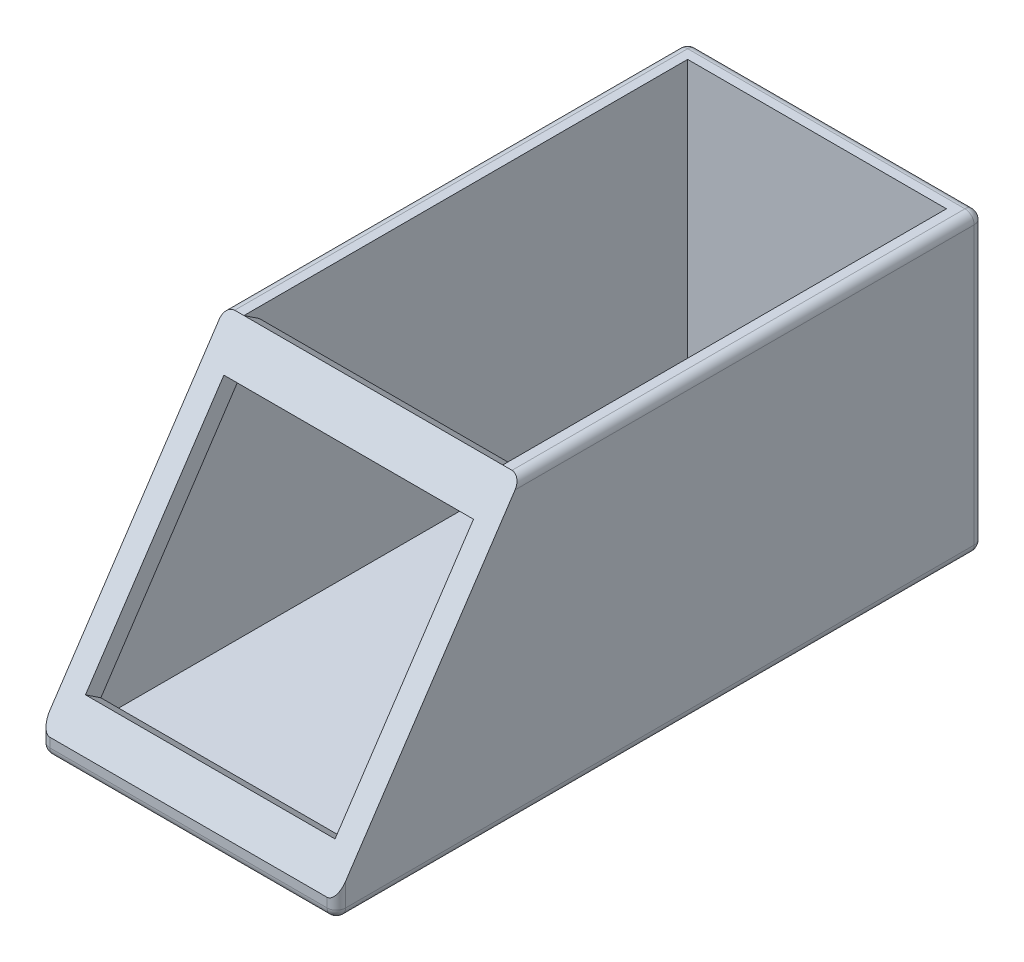
ISO-10303-21;
HEADER;
FILE_DESCRIPTION(('STEP AP214'),'2;1');
FILE_NAME('part.step','',(''),(''),'','','');
FILE_SCHEMA(('AUTOMOTIVE_DESIGN { 1 0 10303 214 1 1 1 1 }'));
ENDSEC;
DATA;
#1=APPLICATION_CONTEXT('core data for automotive mechanical design processes');
#2=APPLICATION_PROTOCOL_DEFINITION('international standard','automotive_design',2000,#1);
#3=PRODUCT_CONTEXT('',#1,'mechanical');
#4=PRODUCT('Part','Part','',(#3));
#5=PRODUCT_RELATED_PRODUCT_CATEGORY('part','',(#4));
#6=PRODUCT_DEFINITION_FORMATION('','',#4);
#7=PRODUCT_DEFINITION_CONTEXT('part definition',#1,'design');
#8=PRODUCT_DEFINITION('design','',#6,#7);
#9=PRODUCT_DEFINITION_SHAPE('','',#8);
#10=(LENGTH_UNIT() NAMED_UNIT(*) SI_UNIT(.MILLI.,.METRE.));
#11=(NAMED_UNIT(*) PLANE_ANGLE_UNIT() SI_UNIT($,.RADIAN.));
#12=(NAMED_UNIT(*) SI_UNIT($,.STERADIAN.) SOLID_ANGLE_UNIT());
#13=UNCERTAINTY_MEASURE_WITH_UNIT(LENGTH_MEASURE(1.E-05),#10,'distance_accuracy_value','');
#14=(GEOMETRIC_REPRESENTATION_CONTEXT(3) GLOBAL_UNCERTAINTY_ASSIGNED_CONTEXT((#13)) GLOBAL_UNIT_ASSIGNED_CONTEXT((#10,
#11,#12)) REPRESENTATION_CONTEXT('',''));
#15=CARTESIAN_POINT('',(0.,0.,0.));
#16=DIRECTION('',(0.,0.,1.));
#17=DIRECTION('',(1.,0.,0.));
#18=AXIS2_PLACEMENT_3D('',#15,#16,#17);
#19=CARTESIAN_POINT('',(0.,2.,0.));
#20=DIRECTION('',(0.,1.,0.));
#21=DIRECTION('',(0.,0.,1.));
#22=AXIS2_PLACEMENT_3D('',#19,#20,#21);
#23=PLANE('',#22);
#24=DIRECTION('',(0.,0.,1.));
#25=VECTOR('',#24,1.);
#26=CARTESIAN_POINT('',(-14.,2.,-35.));
#27=LINE('',#26,#25);
#28=CARTESIAN_POINT('',(-14.,2.,-33.));
#29=VERTEX_POINT('',#28);
#30=CARTESIAN_POINT('',(-14.,2.,32.5962991496907));
#31=VERTEX_POINT('',#30);
#32=EDGE_CURVE('E258',#29,#31,#27,.T.);
#33=ORIENTED_EDGE('',*,*,#32,.T.);
#34=DIRECTION('',(1.,0.,0.));
#35=VECTOR('',#34,1.);
#36=CARTESIAN_POINT('',(0.,2.,32.5962991496907));
#37=LINE('',#36,#35);
#38=CARTESIAN_POINT('',(14.,1.99999999999999,32.5962991496907));
#39=VERTEX_POINT('',#38);
#40=EDGE_CURVE('E240',#31,#39,#37,.T.);
#41=ORIENTED_EDGE('',*,*,#40,.T.);
#42=DIRECTION('',(0.,0.,-1.));
#43=VECTOR('',#42,1.);
#44=CARTESIAN_POINT('',(14.,2.,35.));
#45=LINE('',#44,#43);
#46=CARTESIAN_POINT('',(14.,2.,-33.));
#47=VERTEX_POINT('',#46);
#48=EDGE_CURVE('E245',#39,#47,#45,.T.);
#49=ORIENTED_EDGE('',*,*,#48,.T.);
#50=DIRECTION('',(-1.,0.,0.));
#51=VECTOR('',#50,1.);
#52=CARTESIAN_POINT('',(14.,2.,-33.));
#53=LINE('',#52,#51);
#54=EDGE_CURVE('E269',#47,#29,#53,.T.);
#55=ORIENTED_EDGE('',*,*,#54,.T.);
#56=EDGE_LOOP('',(#33,#41,#49,#55));
#57=FACE_BOUND('',#56,.T.);
#58=ADVANCED_FACE('F38',(#57),#23,.T.);
#59=CARTESIAN_POINT('',(16.,2.,-35.));
#60=DIRECTION('',(-1.,0.,0.));
#61=DIRECTION('',(0.,0.,1.));
#62=AXIS2_PLACEMENT_3D('',#59,#60,#61);
#63=PLANE('',#62);
#64=DIRECTION('',(0.,0.832050294337843,-0.554700196225229));
#65=VECTOR('',#64,1.);
#66=CARTESIAN_POINT('',(16.,2.,35.));
#67=LINE('',#66,#65);
#68=CARTESIAN_POINT('',(16.,3.49999999999999,34.));
#69=VERTEX_POINT('',#68);
#70=CARTESIAN_POINT('',(16.,31.,15.6666666666666));
#71=VERTEX_POINT('',#70);
#72=EDGE_CURVE('E248',#69,#71,#67,.T.);
#73=ORIENTED_EDGE('',*,*,#72,.F.);
#74=DIRECTION('',(0.,-1.,0.));
#75=VECTOR('',#74,1.);
#76=CARTESIAN_POINT('',(16.,2.,34.));
#77=LINE('',#76,#75);
#78=CARTESIAN_POINT('',(16.,1.,34.));
#79=VERTEX_POINT('',#78);
#80=EDGE_CURVE('E367',#69,#79,#77,.T.);
#81=ORIENTED_EDGE('',*,*,#80,.T.);
#82=DIRECTION('',(0.,0.,-1.));
#83=VECTOR('',#82,1.);
#84=CARTESIAN_POINT('',(16.,1.,-35.));
#85=LINE('',#84,#83);
#86=CARTESIAN_POINT('',(16.,1.,-34.));
#87=VERTEX_POINT('',#86);
#88=EDGE_CURVE('E339',#79,#87,#85,.T.);
#89=ORIENTED_EDGE('',*,*,#88,.T.);
#90=DIRECTION('',(0.,-1.,0.));
#91=VECTOR('',#90,1.);
#92=CARTESIAN_POINT('',(16.,2.,-34.));
#93=LINE('',#92,#91);
#94=CARTESIAN_POINT('',(16.,31.,-34.));
#95=VERTEX_POINT('',#94);
#96=EDGE_CURVE('E300',#87,#95,#93,.F.);
#97=ORIENTED_EDGE('',*,*,#96,.T.);
#98=DIRECTION('',(0.,0.,-1.));
#99=VECTOR('',#98,1.);
#100=CARTESIAN_POINT('',(16.,31.,-35.));
#101=LINE('',#100,#99);
#102=EDGE_CURVE('E280',#95,#71,#101,.F.);
#103=ORIENTED_EDGE('',*,*,#102,.T.);
#104=EDGE_LOOP('',(#73,#81,#89,#97,#103));
#105=FACE_BOUND('',#104,.T.);
#106=ADVANCED_FACE('F454',(#105),#63,.F.);
#107=CARTESIAN_POINT('',(-16.,2.,-35.));
#108=DIRECTION('',(0.,0.,1.));
#109=DIRECTION('',(1.,0.,0.));
#110=AXIS2_PLACEMENT_3D('',#107,#108,#109);
#111=PLANE('',#110);
#112=DIRECTION('',(0.,-1.,0.));
#113=VECTOR('',#112,1.);
#114=CARTESIAN_POINT('',(15.,2.,-35.));
#115=LINE('',#114,#113);
#116=CARTESIAN_POINT('',(15.,31.,-35.));
#117=VERTEX_POINT('',#116);
#118=CARTESIAN_POINT('',(15.,1.,-35.));
#119=VERTEX_POINT('',#118);
#120=EDGE_CURVE('E297',#117,#119,#115,.T.);
#121=ORIENTED_EDGE('',*,*,#120,.T.);
#122=DIRECTION('',(-1.,0.,0.));
#123=VECTOR('',#122,1.);
#124=CARTESIAN_POINT('',(-16.,1.,-35.));
#125=LINE('',#124,#123);
#126=CARTESIAN_POINT('',(-15.,1.,-35.));
#127=VERTEX_POINT('',#126);
#128=EDGE_CURVE('E335',#119,#127,#125,.T.);
#129=ORIENTED_EDGE('',*,*,#128,.T.);
#130=DIRECTION('',(0.,-1.,0.));
#131=VECTOR('',#130,1.);
#132=CARTESIAN_POINT('',(-15.,2.,-35.));
#133=LINE('',#132,#131);
#134=CARTESIAN_POINT('',(-15.,31.,-35.));
#135=VERTEX_POINT('',#134);
#136=EDGE_CURVE('E295',#127,#135,#133,.F.);
#137=ORIENTED_EDGE('',*,*,#136,.T.);
#138=DIRECTION('',(-1.,0.,0.));
#139=VECTOR('',#138,1.);
#140=CARTESIAN_POINT('',(-16.,31.,-35.));
#141=LINE('',#140,#139);
#142=EDGE_CURVE('E293',#135,#117,#141,.F.);
#143=ORIENTED_EDGE('',*,*,#142,.T.);
#144=EDGE_LOOP('',(#121,#129,#137,#143));
#145=FACE_BOUND('',#144,.T.);
#146=ADVANCED_FACE('F434',(#145),#111,.F.);
#147=CARTESIAN_POINT('',(-16.,2.,-35.));
#148=DIRECTION('',(1.,0.,0.));
#149=DIRECTION('',(0.,0.,-1.));
#150=AXIS2_PLACEMENT_3D('',#147,#148,#149);
#151=PLANE('',#150);
#152=DIRECTION('',(0.,0.,1.));
#153=VECTOR('',#152,1.);
#154=CARTESIAN_POINT('',(-16.,1.,-35.));
#155=LINE('',#154,#153);
#156=CARTESIAN_POINT('',(-16.,1.,-34.));
#157=VERTEX_POINT('',#156);
#158=CARTESIAN_POINT('',(-16.,1.,34.));
#159=VERTEX_POINT('',#158);
#160=EDGE_CURVE('E311',#157,#159,#155,.T.);
#161=ORIENTED_EDGE('',*,*,#160,.T.);
#162=DIRECTION('',(0.,-1.,0.));
#163=VECTOR('',#162,1.);
#164=CARTESIAN_POINT('',(-16.,2.,34.));
#165=LINE('',#164,#163);
#166=CARTESIAN_POINT('',(-16.,3.49999999999998,34.));
#167=VERTEX_POINT('',#166);
#168=EDGE_CURVE('E360',#159,#167,#165,.F.);
#169=ORIENTED_EDGE('',*,*,#168,.T.);
#170=DIRECTION('',(0.,0.832050294337844,-0.554700196225229));
#171=VECTOR('',#170,1.);
#172=CARTESIAN_POINT('',(-16.,2.,35.));
#173=LINE('',#172,#171);
#174=CARTESIAN_POINT('',(-16.,31.,15.6666666666666));
#175=VERTEX_POINT('',#174);
#176=EDGE_CURVE('E255',#167,#175,#173,.T.);
#177=ORIENTED_EDGE('',*,*,#176,.T.);
#178=DIRECTION('',(0.,0.,1.));
#179=VECTOR('',#178,1.);
#180=CARTESIAN_POINT('',(-16.,31.,-35.));
#181=LINE('',#180,#179);
#182=CARTESIAN_POINT('',(-16.,31.,-34.));
#183=VERTEX_POINT('',#182);
#184=EDGE_CURVE('E290',#175,#183,#181,.F.);
#185=ORIENTED_EDGE('',*,*,#184,.T.);
#186=DIRECTION('',(0.,-1.,0.));
#187=VECTOR('',#186,1.);
#188=CARTESIAN_POINT('',(-16.,2.,-34.));
#189=LINE('',#188,#187);
#190=EDGE_CURVE('E304',#183,#157,#189,.T.);
#191=ORIENTED_EDGE('',*,*,#190,.T.);
#192=EDGE_LOOP('',(#161,#169,#177,#185,#191));
#193=FACE_BOUND('',#192,.T.);
#194=ADVANCED_FACE('F405',(#193),#151,.F.);
#195=CARTESIAN_POINT('',(-16.,2.,35.));
#196=DIRECTION('',(0.,0.,-1.));
#197=DIRECTION('',(-1.,0.,0.));
#198=AXIS2_PLACEMENT_3D('',#195,#196,#197);
#199=PLANE('',#198);
#200=DIRECTION('',(1.,0.,0.));
#201=VECTOR('',#200,1.);
#202=CARTESIAN_POINT('',(-16.,2.,35.));
#203=LINE('',#202,#201);
#204=CARTESIAN_POINT('',(-15.,2.,35.));
#205=VERTEX_POINT('',#204);
#206=CARTESIAN_POINT('',(15.,2.,35.));
#207=VERTEX_POINT('',#206);
#208=EDGE_CURVE('E275',#205,#207,#203,.T.);
#209=ORIENTED_EDGE('',*,*,#208,.F.);
#210=DIRECTION('',(0.,-1.,0.));
#211=VECTOR('',#210,1.);
#212=CARTESIAN_POINT('',(-15.,2.,35.));
#213=LINE('',#212,#211);
#214=CARTESIAN_POINT('',(-15.,1.,35.));
#215=VERTEX_POINT('',#214);
#216=EDGE_CURVE('E357',#205,#215,#213,.T.);
#217=ORIENTED_EDGE('',*,*,#216,.T.);
#218=DIRECTION('',(1.,0.,0.));
#219=VECTOR('',#218,1.);
#220=CARTESIAN_POINT('',(-16.,1.,35.));
#221=LINE('',#220,#219);
#222=CARTESIAN_POINT('',(15.,1.,35.));
#223=VERTEX_POINT('',#222);
#224=EDGE_CURVE('E341',#215,#223,#221,.T.);
#225=ORIENTED_EDGE('',*,*,#224,.T.);
#226=DIRECTION('',(0.,-1.,0.));
#227=VECTOR('',#226,1.);
#228=CARTESIAN_POINT('',(15.,2.,35.));
#229=LINE('',#228,#227);
#230=EDGE_CURVE('E354',#223,#207,#229,.F.);
#231=ORIENTED_EDGE('',*,*,#230,.T.);
#232=EDGE_LOOP('',(#209,#217,#225,#231));
#233=FACE_BOUND('',#232,.T.);
#234=ADVANCED_FACE('F391',(#233),#199,.F.);
#235=CARTESIAN_POINT('',(0.,0.,0.));
#236=DIRECTION('',(0.,1.,0.));
#237=DIRECTION('',(0.,0.,1.));
#238=AXIS2_PLACEMENT_3D('',#235,#236,#237);
#239=PLANE('',#238);
#240=DIRECTION('',(0.,0.,-1.));
#241=VECTOR('',#240,1.);
#242=CARTESIAN_POINT('',(15.,0.,0.));
#243=LINE('',#242,#241);
#244=CARTESIAN_POINT('',(15.,0.,-34.));
#245=VERTEX_POINT('',#244);
#246=CARTESIAN_POINT('',(15.,0.,34.));
#247=VERTEX_POINT('',#246);
#248=EDGE_CURVE('E326',#245,#247,#243,.F.);
#249=ORIENTED_EDGE('',*,*,#248,.T.);
#250=DIRECTION('',(1.,0.,0.));
#251=VECTOR('',#250,1.);
#252=CARTESIAN_POINT('',(0.,0.,34.));
#253=LINE('',#252,#251);
#254=CARTESIAN_POINT('',(-15.,0.,34.));
#255=VERTEX_POINT('',#254);
#256=EDGE_CURVE('E11',#247,#255,#253,.F.);
#257=ORIENTED_EDGE('',*,*,#256,.T.);
#258=DIRECTION('',(0.,0.,1.));
#259=VECTOR('',#258,1.);
#260=CARTESIAN_POINT('',(-15.,0.,0.));
#261=LINE('',#260,#259);
#262=CARTESIAN_POINT('',(-15.,0.,-34.));
#263=VERTEX_POINT('',#262);
#264=EDGE_CURVE('E331',#255,#263,#261,.F.);
#265=ORIENTED_EDGE('',*,*,#264,.T.);
#266=DIRECTION('',(-1.,0.,0.));
#267=VECTOR('',#266,1.);
#268=CARTESIAN_POINT('',(0.,0.,-34.));
#269=LINE('',#268,#267);
#270=EDGE_CURVE('E329',#263,#245,#269,.F.);
#271=ORIENTED_EDGE('',*,*,#270,.T.);
#272=EDGE_LOOP('',(#249,#257,#265,#271));
#273=FACE_BOUND('',#272,.T.);
#274=ADVANCED_FACE('F466',(#273),#239,.F.);
#275=CARTESIAN_POINT('',(14.,32.,-33.));
#276=DIRECTION('',(0.,-1.,0.));
#277=DIRECTION('',(0.,0.,-1.));
#278=AXIS2_PLACEMENT_3D('',#275,#276,#277);
#279=PLANE('',#278);
#280=DIRECTION('',(0.,0.,-1.));
#281=VECTOR('',#280,1.);
#282=CARTESIAN_POINT('',(15.,32.,-33.));
#283=LINE('',#282,#281);
#284=CARTESIAN_POINT('',(15.,32.,15.));
#285=VERTEX_POINT('',#284);
#286=CARTESIAN_POINT('',(15.,32.,-34.));
#287=VERTEX_POINT('',#286);
#288=EDGE_CURVE('E277',#285,#287,#283,.T.);
#289=ORIENTED_EDGE('',*,*,#288,.T.);
#290=DIRECTION('',(-1.,0.,0.));
#291=VECTOR('',#290,1.);
#292=CARTESIAN_POINT('',(14.,32.,-34.));
#293=LINE('',#292,#291);
#294=CARTESIAN_POINT('',(-15.,32.,-34.));
#295=VERTEX_POINT('',#294);
#296=EDGE_CURVE('E309',#287,#295,#293,.T.);
#297=ORIENTED_EDGE('',*,*,#296,.T.);
#298=DIRECTION('',(0.,0.,1.));
#299=VECTOR('',#298,1.);
#300=CARTESIAN_POINT('',(-15.,32.,-33.));
#301=LINE('',#300,#299);
#302=CARTESIAN_POINT('',(-15.,32.,15.));
#303=VERTEX_POINT('',#302);
#304=EDGE_CURVE('E285',#295,#303,#301,.T.);
#305=ORIENTED_EDGE('',*,*,#304,.T.);
#306=DIRECTION('',(-1.,0.,0.));
#307=VECTOR('',#306,1.);
#308=CARTESIAN_POINT('',(-14.,32.,15.));
#309=LINE('',#308,#307);
#310=CARTESIAN_POINT('',(-14.,32.,15.));
#311=VERTEX_POINT('',#310);
#312=EDGE_CURVE('E260',#311,#303,#309,.T.);
#313=ORIENTED_EDGE('',*,*,#312,.F.);
#314=DIRECTION('',(0.,0.,1.));
#315=VECTOR('',#314,1.);
#316=CARTESIAN_POINT('',(-14.,32.,-35.));
#317=LINE('',#316,#315);
#318=CARTESIAN_POINT('',(-14.,32.,-33.));
#319=VERTEX_POINT('',#318);
#320=EDGE_CURVE('E256',#319,#311,#317,.T.);
#321=ORIENTED_EDGE('',*,*,#320,.F.);
#322=DIRECTION('',(-1.,0.,0.));
#323=VECTOR('',#322,1.);
#324=CARTESIAN_POINT('',(14.,32.,-33.));
#325=LINE('',#324,#323);
#326=CARTESIAN_POINT('',(14.,32.,-33.));
#327=VERTEX_POINT('',#326);
#328=EDGE_CURVE('E264',#327,#319,#325,.T.);
#329=ORIENTED_EDGE('',*,*,#328,.F.);
#330=DIRECTION('',(0.,0.,-1.));
#331=VECTOR('',#330,1.);
#332=CARTESIAN_POINT('',(14.,32.,15.));
#333=LINE('',#332,#331);
#334=CARTESIAN_POINT('',(14.,32.,15.));
#335=VERTEX_POINT('',#334);
#336=EDGE_CURVE('E247',#335,#327,#333,.T.);
#337=ORIENTED_EDGE('',*,*,#336,.F.);
#338=DIRECTION('',(1.,0.,0.));
#339=VECTOR('',#338,1.);
#340=CARTESIAN_POINT('',(14.,32.,15.));
#341=LINE('',#340,#339);
#342=EDGE_CURVE('E250',#335,#285,#341,.T.);
#343=ORIENTED_EDGE('',*,*,#342,.T.);
#344=EDGE_LOOP('',(#289,#297,#305,#313,#321,#329,#337,#343));
#345=FACE_BOUND('',#344,.T.);
#346=ADVANCED_FACE('F464',(#345),#279,.F.);
#347=CARTESIAN_POINT('',(0.,0.,-33.));
#348=DIRECTION('',(0.,0.,-1.));
#349=DIRECTION('',(-1.,0.,0.));
#350=AXIS2_PLACEMENT_3D('',#347,#348,#349);
#351=PLANE('',#350);
#352=ORIENTED_EDGE('',*,*,#328,.T.);
#353=DIRECTION('',(0.,1.,0.));
#354=VECTOR('',#353,1.);
#355=CARTESIAN_POINT('',(-14.,2.,-33.));
#356=LINE('',#355,#354);
#357=EDGE_CURVE('E266',#29,#319,#356,.T.);
#358=ORIENTED_EDGE('',*,*,#357,.F.);
#359=ORIENTED_EDGE('',*,*,#54,.F.);
#360=DIRECTION('',(0.,1.,0.));
#361=VECTOR('',#360,1.);
#362=CARTESIAN_POINT('',(14.,2.,-33.));
#363=LINE('',#362,#361);
#364=EDGE_CURVE('E272',#47,#327,#363,.T.);
#365=ORIENTED_EDGE('',*,*,#364,.T.);
#366=EDGE_LOOP('',(#352,#358,#359,#365));
#367=FACE_BOUND('',#366,.T.);
#368=ADVANCED_FACE('F580',(#367),#351,.F.);
#369=CARTESIAN_POINT('',(-14.,0.,0.));
#370=DIRECTION('',(1.,0.,0.));
#371=DIRECTION('',(0.,0.,-1.));
#372=AXIS2_PLACEMENT_3D('',#369,#370,#371);
#373=PLANE('',#372);
#374=DIRECTION('',(0.,0.55470019622523,0.832050294337843));
#375=VECTOR('',#374,1.);
#376=CARTESIAN_POINT('',(-14.,30.8905996075495,13.3358994113243));
#377=LINE('',#376,#375);
#378=CARTESIAN_POINT('',(-14.,30.8905996075495,13.3358994113243));
#379=VERTEX_POINT('',#378);
#380=EDGE_CURVE('E55',#379,#311,#377,.T.);
#381=ORIENTED_EDGE('',*,*,#380,.F.);
#382=DIRECTION('',(0.,-0.832050294337843,0.55470019622523));
#383=VECTOR('',#382,1.);
#384=CARTESIAN_POINT('',(-14.,30.8905996075495,13.3358994113243));
#385=LINE('',#384,#383);
#386=EDGE_CURVE('E59',#379,#31,#385,.T.);
#387=ORIENTED_EDGE('',*,*,#386,.T.);
#388=ORIENTED_EDGE('',*,*,#32,.F.);
#389=ORIENTED_EDGE('',*,*,#357,.T.);
#390=ORIENTED_EDGE('',*,*,#320,.T.);
#391=EDGE_LOOP('',(#381,#387,#388,#389,#390));
#392=FACE_BOUND('',#391,.T.);
#393=ADVANCED_FACE('F588',(#392),#373,.T.);
#394=CARTESIAN_POINT('',(-14.,2.,35.));
#395=DIRECTION('',(0.,0.554700196225229,0.832050294337844));
#396=DIRECTION('',(0.,-0.832050294337844,0.554700196225229));
#397=AXIS2_PLACEMENT_3D('',#394,#395,#396);
#398=PLANE('',#397);
#399=ORIENTED_EDGE('',*,*,#176,.F.);
#400=CARTESIAN_POINT('',(-15.,3.49999999999998,34.));
#401=DIRECTION('',(0.,0.554700196225229,0.832050294337844));
#402=DIRECTION('',(0.,-0.832050294337844,0.554700196225229));
#403=AXIS2_PLACEMENT_3D('',#400,#401,#402);
#404=ELLIPSE('',#403,1.80277563773199,1.);
#405=EDGE_CURVE('E362',#167,#205,#404,.T.);
#406=ORIENTED_EDGE('',*,*,#405,.T.);
#407=ORIENTED_EDGE('',*,*,#208,.T.);
#408=CARTESIAN_POINT('',(15.,3.49999999999999,34.));
#409=DIRECTION('',(0.,-0.554700196225229,-0.832050294337843));
#410=DIRECTION('',(0.,-0.832050294337843,0.554700196225229));
#411=AXIS2_PLACEMENT_3D('',#408,#409,#410);
#412=ELLIPSE('',#411,1.80277563773199,1.);
#413=EDGE_CURVE('E369',#207,#69,#412,.F.);
#414=ORIENTED_EDGE('',*,*,#413,.T.);
#415=ORIENTED_EDGE('',*,*,#72,.T.);
#416=CARTESIAN_POINT('',(15.,31.,15.6666666666666));
#417=DIRECTION('',(0.,-0.554700196225229,-0.832050294337843));
#418=DIRECTION('',(0.,0.832050294337843,-0.554700196225229));
#419=AXIS2_PLACEMENT_3D('',#416,#417,#418);
#420=ELLIPSE('',#419,1.20185042515466,1.);
#421=EDGE_CURVE('E283',#71,#285,#420,.F.);
#422=ORIENTED_EDGE('',*,*,#421,.T.);
#423=ORIENTED_EDGE('',*,*,#342,.F.);
#424=DIRECTION('',(-1.,0.,0.));
#425=VECTOR('',#424,1.);
#426=CARTESIAN_POINT('',(-14.,32.,15.));
#427=LINE('',#426,#425);
#428=EDGE_CURVE('E226',#335,#311,#427,.T.);
#429=ORIENTED_EDGE('',*,*,#428,.T.);
#430=ORIENTED_EDGE('',*,*,#312,.T.);
#431=CARTESIAN_POINT('',(-15.,31.,15.6666666666666));
#432=DIRECTION('',(0.,0.554700196225229,0.832050294337844));
#433=DIRECTION('',(0.,-0.832050294337844,0.554700196225229));
#434=AXIS2_PLACEMENT_3D('',#431,#432,#433);
#435=ELLIPSE('',#434,1.20185042515466,1.);
#436=EDGE_CURVE('E287',#303,#175,#435,.T.);
#437=ORIENTED_EDGE('',*,*,#436,.T.);
#438=EDGE_LOOP('',(#399,#406,#407,#414,#415,#422,#423,#429,#430,#437));
#439=FACE_BOUND('',#438,.T.);
#440=DIRECTION('',(0.,0.832050294337843,-0.55470019622523));
#441=VECTOR('',#440,1.);
#442=CARTESIAN_POINT('',(13.5,28.0019097427917,17.6653935048055));
#443=LINE('',#442,#441);
#444=CARTESIAN_POINT('',(13.5,5.53655179566988,32.6422988028867));
#445=VERTEX_POINT('',#444);
#446=CARTESIAN_POINT('',(13.5,28.0019097427916,17.6653935048055));
#447=VERTEX_POINT('',#446);
#448=EDGE_CURVE('E194',#445,#447,#443,.T.);
#449=ORIENTED_EDGE('',*,*,#448,.F.);
#450=DIRECTION('',(1.,0.,0.));
#451=VECTOR('',#450,1.);
#452=CARTESIAN_POINT('',(-13.5,5.53655179566988,32.6422988028867));
#453=LINE('',#452,#451);
#454=CARTESIAN_POINT('',(-13.5,5.53655179566988,32.6422988028867));
#455=VERTEX_POINT('',#454);
#456=EDGE_CURVE('E211',#455,#445,#453,.T.);
#457=ORIENTED_EDGE('',*,*,#456,.F.);
#458=DIRECTION('',(0.,-0.832050294337843,0.55470019622523));
#459=VECTOR('',#458,1.);
#460=CARTESIAN_POINT('',(-13.5,28.0019097427917,17.6653935048055));
#461=LINE('',#460,#459);
#462=CARTESIAN_POINT('',(-13.5,28.0019097427917,17.6653935048055));
#463=VERTEX_POINT('',#462);
#464=EDGE_CURVE('E214',#463,#455,#461,.T.);
#465=ORIENTED_EDGE('',*,*,#464,.F.);
#466=DIRECTION('',(-1.,0.,0.));
#467=VECTOR('',#466,1.);
#468=CARTESIAN_POINT('',(-13.5,28.0019097427917,17.6653935048055));
#469=LINE('',#468,#467);
#470=EDGE_CURVE('E220',#447,#463,#469,.T.);
#471=ORIENTED_EDGE('',*,*,#470,.F.);
#472=EDGE_LOOP('',(#449,#457,#465,#471));
#473=FACE_BOUND('',#472,.T.);
#474=ADVANCED_FACE('F413',(#439,#473),#398,.T.);
#475=CARTESIAN_POINT('',(14.,0.,0.));
#476=DIRECTION('',(1.,0.,0.));
#477=DIRECTION('',(0.,0.,-1.));
#478=AXIS2_PLACEMENT_3D('',#475,#476,#477);
#479=PLANE('',#478);
#480=DIRECTION('',(0.,0.832050294337843,-0.554700196225229));
#481=VECTOR('',#480,1.);
#482=CARTESIAN_POINT('',(14.,30.8905996075495,13.3358994113243));
#483=LINE('',#482,#481);
#484=CARTESIAN_POINT('',(14.,30.8905996075495,13.3358994113243));
#485=VERTEX_POINT('',#484);
#486=EDGE_CURVE('E231',#39,#485,#483,.T.);
#487=ORIENTED_EDGE('',*,*,#486,.T.);
#488=DIRECTION('',(0.,0.55470019622523,0.832050294337843));
#489=VECTOR('',#488,1.);
#490=CARTESIAN_POINT('',(14.,30.8905996075495,13.3358994113243));
#491=LINE('',#490,#489);
#492=EDGE_CURVE('E236',#485,#335,#491,.T.);
#493=ORIENTED_EDGE('',*,*,#492,.T.);
#494=ORIENTED_EDGE('',*,*,#336,.T.);
#495=ORIENTED_EDGE('',*,*,#364,.F.);
#496=ORIENTED_EDGE('',*,*,#48,.F.);
#497=EDGE_LOOP('',(#487,#493,#494,#495,#496));
#498=FACE_BOUND('',#497,.T.);
#499=ADVANCED_FACE('F480',(#498),#479,.F.);
#500=CARTESIAN_POINT('',(15.,31.,-33.));
#501=DIRECTION('',(0.,0.,-1.));
#502=DIRECTION('',(-1.,0.,0.));
#503=AXIS2_PLACEMENT_3D('',#500,#501,#502);
#504=CYLINDRICAL_SURFACE('',#503,1.);
#505=ORIENTED_EDGE('',*,*,#102,.F.);
#506=CARTESIAN_POINT('',(15.,31.,-34.));
#507=DIRECTION('',(0.,0.,-1.));
#508=DIRECTION('',(-1.,0.,0.));
#509=AXIS2_PLACEMENT_3D('',#506,#507,#508);
#510=CIRCLE('',#509,1.);
#511=EDGE_CURVE('E302',#95,#287,#510,.F.);
#512=ORIENTED_EDGE('',*,*,#511,.T.);
#513=ORIENTED_EDGE('',*,*,#288,.F.);
#514=ORIENTED_EDGE('',*,*,#421,.F.);
#515=EDGE_LOOP('',(#505,#512,#513,#514));
#516=FACE_BOUND('',#515,.T.);
#517=ADVANCED_FACE('F476',(#516),#504,.T.);
#518=CARTESIAN_POINT('',(-15.,31.,-33.));
#519=DIRECTION('',(0.,0.,1.));
#520=DIRECTION('',(1.,0.,0.));
#521=AXIS2_PLACEMENT_3D('',#518,#519,#520);
#522=CYLINDRICAL_SURFACE('',#521,1.);
#523=ORIENTED_EDGE('',*,*,#304,.F.);
#524=CARTESIAN_POINT('',(-15.,31.,-34.));
#525=DIRECTION('',(0.,0.,1.));
#526=DIRECTION('',(1.,0.,0.));
#527=AXIS2_PLACEMENT_3D('',#524,#525,#526);
#528=CIRCLE('',#527,1.);
#529=EDGE_CURVE('E307',#295,#183,#528,.T.);
#530=ORIENTED_EDGE('',*,*,#529,.T.);
#531=ORIENTED_EDGE('',*,*,#184,.F.);
#532=ORIENTED_EDGE('',*,*,#436,.F.);
#533=EDGE_LOOP('',(#523,#530,#531,#532));
#534=FACE_BOUND('',#533,.T.);
#535=ADVANCED_FACE('F479',(#534),#522,.T.);
#536=CARTESIAN_POINT('',(-15.,2.,-34.));
#537=DIRECTION('',(0.,-1.,0.));
#538=DIRECTION('',(0.,0.,-1.));
#539=AXIS2_PLACEMENT_3D('',#536,#537,#538);
#540=CYLINDRICAL_SURFACE('',#539,1.);
#541=ORIENTED_EDGE('',*,*,#136,.F.);
#542=CARTESIAN_POINT('',(-15.,1.,-34.));
#543=DIRECTION('',(0.,-1.,0.));
#544=DIRECTION('',(0.,0.,-1.));
#545=AXIS2_PLACEMENT_3D('',#542,#543,#544);
#546=CIRCLE('',#545,1.);
#547=EDGE_CURVE('E333',#127,#157,#546,.F.);
#548=ORIENTED_EDGE('',*,*,#547,.T.);
#549=ORIENTED_EDGE('',*,*,#190,.F.);
#550=CARTESIAN_POINT('',(-15.,31.,-34.));
#551=DIRECTION('',(0.,1.,0.));
#552=DIRECTION('',(0.,0.,1.));
#553=AXIS2_PLACEMENT_3D('',#550,#551,#552);
#554=CIRCLE('',#553,1.);
#555=EDGE_CURVE('E252',#135,#183,#554,.T.);
#556=ORIENTED_EDGE('',*,*,#555,.F.);
#557=EDGE_LOOP('',(#541,#548,#549,#556));
#558=FACE_BOUND('',#557,.T.);
#559=ADVANCED_FACE('F421',(#558),#540,.T.);
#560=CARTESIAN_POINT('',(-15.,31.,-34.));
#561=DIRECTION('',(0.,0.,1.));
#562=DIRECTION('',(1.,0.,0.));
#563=AXIS2_PLACEMENT_3D('',#560,#561,#562);
#564=SPHERICAL_SURFACE('',#563,1.);
#565=ORIENTED_EDGE('',*,*,#555,.T.);
#566=ORIENTED_EDGE('',*,*,#529,.F.);
#567=CARTESIAN_POINT('',(-15.,31.,-34.));
#568=DIRECTION('',(1.,0.,0.));
#569=DIRECTION('',(0.,0.,-1.));
#570=AXIS2_PLACEMENT_3D('',#567,#568,#569);
#571=CIRCLE('',#570,1.);
#572=EDGE_CURVE('E319',#135,#295,#571,.T.);
#573=ORIENTED_EDGE('',*,*,#572,.F.);
#574=EDGE_LOOP('',(#565,#566,#573));
#575=FACE_BOUND('',#574,.T.);
#576=ADVANCED_FACE('F426',(#575),#564,.T.);
#577=CARTESIAN_POINT('',(14.,31.,-34.));
#578=DIRECTION('',(-1.,0.,0.));
#579=DIRECTION('',(0.,0.,1.));
#580=AXIS2_PLACEMENT_3D('',#577,#578,#579);
#581=CYLINDRICAL_SURFACE('',#580,1.);
#582=ORIENTED_EDGE('',*,*,#572,.T.);
#583=ORIENTED_EDGE('',*,*,#296,.F.);
#584=CARTESIAN_POINT('',(15.,31.,-34.));
#585=DIRECTION('',(1.,0.,0.));
#586=DIRECTION('',(0.,0.,-1.));
#587=AXIS2_PLACEMENT_3D('',#584,#585,#586);
#588=CIRCLE('',#587,1.);
#589=EDGE_CURVE('E315',#117,#287,#588,.T.);
#590=ORIENTED_EDGE('',*,*,#589,.F.);
#591=ORIENTED_EDGE('',*,*,#142,.F.);
#592=EDGE_LOOP('',(#582,#583,#590,#591));
#593=FACE_BOUND('',#592,.T.);
#594=ADVANCED_FACE('F431',(#593),#581,.T.);
#595=CARTESIAN_POINT('',(15.,31.,-34.));
#596=DIRECTION('',(0.,0.,1.));
#597=DIRECTION('',(1.,0.,0.));
#598=AXIS2_PLACEMENT_3D('',#595,#596,#597);
#599=SPHERICAL_SURFACE('',#598,1.);
#600=ORIENTED_EDGE('',*,*,#589,.T.);
#601=ORIENTED_EDGE('',*,*,#511,.F.);
#602=CARTESIAN_POINT('',(15.,31.,-34.));
#603=DIRECTION('',(0.,-1.,0.));
#604=DIRECTION('',(0.,0.,-1.));
#605=AXIS2_PLACEMENT_3D('',#602,#603,#604);
#606=CIRCLE('',#605,1.);
#607=EDGE_CURVE('E312',#117,#95,#606,.T.);
#608=ORIENTED_EDGE('',*,*,#607,.F.);
#609=EDGE_LOOP('',(#600,#601,#608));
#610=FACE_BOUND('',#609,.T.);
#611=ADVANCED_FACE('F488',(#610),#599,.T.);
#612=CARTESIAN_POINT('',(15.,2.,-34.));
#613=DIRECTION('',(0.,-1.,0.));
#614=DIRECTION('',(0.,0.,-1.));
#615=AXIS2_PLACEMENT_3D('',#612,#613,#614);
#616=CYLINDRICAL_SURFACE('',#615,1.);
#617=ORIENTED_EDGE('',*,*,#96,.F.);
#618=CARTESIAN_POINT('',(15.,1.,-34.));
#619=DIRECTION('',(0.,-1.,0.));
#620=DIRECTION('',(0.,0.,-1.));
#621=AXIS2_PLACEMENT_3D('',#618,#619,#620);
#622=CIRCLE('',#621,1.);
#623=EDGE_CURVE('E337',#87,#119,#622,.F.);
#624=ORIENTED_EDGE('',*,*,#623,.T.);
#625=ORIENTED_EDGE('',*,*,#120,.F.);
#626=ORIENTED_EDGE('',*,*,#607,.T.);
#627=EDGE_LOOP('',(#617,#624,#625,#626));
#628=FACE_BOUND('',#627,.T.);
#629=ADVANCED_FACE('F484',(#628),#616,.T.);
#630=CARTESIAN_POINT('',(15.,1.,-35.));
#631=DIRECTION('',(0.,0.,-1.));
#632=DIRECTION('',(-1.,0.,0.));
#633=AXIS2_PLACEMENT_3D('',#630,#631,#632);
#634=CYLINDRICAL_SURFACE('',#633,1.);
#635=ORIENTED_EDGE('',*,*,#88,.F.);
#636=CARTESIAN_POINT('',(15.,1.,34.));
#637=DIRECTION('',(0.,0.,-1.));
#638=DIRECTION('',(-1.,0.,0.));
#639=AXIS2_PLACEMENT_3D('',#636,#637,#638);
#640=CIRCLE('',#639,1.);
#641=EDGE_CURVE('E47',#79,#247,#640,.T.);
#642=ORIENTED_EDGE('',*,*,#641,.T.);
#643=ORIENTED_EDGE('',*,*,#248,.F.);
#644=CARTESIAN_POINT('',(15.,1.,-34.));
#645=DIRECTION('',(0.,0.,-1.));
#646=DIRECTION('',(-1.,0.,0.));
#647=AXIS2_PLACEMENT_3D('',#644,#645,#646);
#648=CIRCLE('',#647,1.);
#649=EDGE_CURVE('E316',#87,#245,#648,.T.);
#650=ORIENTED_EDGE('',*,*,#649,.F.);
#651=EDGE_LOOP('',(#635,#642,#643,#650));
#652=FACE_BOUND('',#651,.T.);
#653=ADVANCED_FACE('F487',(#652),#634,.T.);
#654=CARTESIAN_POINT('',(15.,1.,-34.));
#655=DIRECTION('',(0.,1.,0.));
#656=DIRECTION('',(0.,0.,1.));
#657=AXIS2_PLACEMENT_3D('',#654,#655,#656);
#658=SPHERICAL_SURFACE('',#657,1.);
#659=ORIENTED_EDGE('',*,*,#623,.F.);
#660=ORIENTED_EDGE('',*,*,#649,.T.);
#661=CARTESIAN_POINT('',(15.,1.,-34.));
#662=DIRECTION('',(-1.,0.,0.));
#663=DIRECTION('',(0.,0.,1.));
#664=AXIS2_PLACEMENT_3D('',#661,#662,#663);
#665=CIRCLE('',#664,1.);
#666=EDGE_CURVE('E348',#119,#245,#665,.T.);
#667=ORIENTED_EDGE('',*,*,#666,.F.);
#668=EDGE_LOOP('',(#659,#660,#667));
#669=FACE_BOUND('',#668,.T.);
#670=ADVANCED_FACE('F451',(#669),#658,.T.);
#671=CARTESIAN_POINT('',(-16.,1.,-34.));
#672=DIRECTION('',(-1.,0.,0.));
#673=DIRECTION('',(0.,0.,1.));
#674=AXIS2_PLACEMENT_3D('',#671,#672,#673);
#675=CYLINDRICAL_SURFACE('',#674,1.);
#676=CARTESIAN_POINT('',(-15.,1.,-34.));
#677=DIRECTION('',(-1.,0.,0.));
#678=DIRECTION('',(0.,0.,1.));
#679=AXIS2_PLACEMENT_3D('',#676,#677,#678);
#680=CIRCLE('',#679,1.);
#681=EDGE_CURVE('E345',#127,#263,#680,.T.);
#682=ORIENTED_EDGE('',*,*,#681,.F.);
#683=ORIENTED_EDGE('',*,*,#128,.F.);
#684=ORIENTED_EDGE('',*,*,#666,.T.);
#685=ORIENTED_EDGE('',*,*,#270,.F.);
#686=EDGE_LOOP('',(#682,#683,#684,#685));
#687=FACE_BOUND('',#686,.T.);
#688=ADVANCED_FACE('F441',(#687),#675,.T.);
#689=CARTESIAN_POINT('',(-15.,1.,-34.));
#690=DIRECTION('',(0.,1.,0.));
#691=DIRECTION('',(0.,0.,1.));
#692=AXIS2_PLACEMENT_3D('',#689,#690,#691);
#693=SPHERICAL_SURFACE('',#692,1.);
#694=ORIENTED_EDGE('',*,*,#547,.F.);
#695=ORIENTED_EDGE('',*,*,#681,.T.);
#696=CARTESIAN_POINT('',(-15.,1.,-34.));
#697=DIRECTION('',(0.,0.,1.));
#698=DIRECTION('',(1.,0.,0.));
#699=AXIS2_PLACEMENT_3D('',#696,#697,#698);
#700=CIRCLE('',#699,1.);
#701=EDGE_CURVE('E342',#157,#263,#700,.T.);
#702=ORIENTED_EDGE('',*,*,#701,.F.);
#703=EDGE_LOOP('',(#694,#695,#702));
#704=FACE_BOUND('',#703,.T.);
#705=ADVANCED_FACE('F443',(#704),#693,.T.);
#706=CARTESIAN_POINT('',(-15.,1.,-35.));
#707=DIRECTION('',(0.,0.,1.));
#708=DIRECTION('',(1.,0.,0.));
#709=AXIS2_PLACEMENT_3D('',#706,#707,#708);
#710=CYLINDRICAL_SURFACE('',#709,1.);
#711=ORIENTED_EDGE('',*,*,#264,.F.);
#712=CARTESIAN_POINT('',(-15.,1.,34.));
#713=DIRECTION('',(0.,0.,1.));
#714=DIRECTION('',(1.,0.,0.));
#715=AXIS2_PLACEMENT_3D('',#712,#713,#714);
#716=CIRCLE('',#715,1.);
#717=EDGE_CURVE('E365',#255,#159,#716,.F.);
#718=ORIENTED_EDGE('',*,*,#717,.T.);
#719=ORIENTED_EDGE('',*,*,#160,.F.);
#720=ORIENTED_EDGE('',*,*,#701,.T.);
#721=EDGE_LOOP('',(#711,#718,#719,#720));
#722=FACE_BOUND('',#721,.T.);
#723=ADVANCED_FACE('F402',(#722),#710,.T.);
#724=CARTESIAN_POINT('',(15.,2.,34.));
#725=DIRECTION('',(0.,-1.,0.));
#726=DIRECTION('',(0.,0.,-1.));
#727=AXIS2_PLACEMENT_3D('',#724,#725,#726);
#728=CYLINDRICAL_SURFACE('',#727,1.);
#729=CARTESIAN_POINT('',(15.,1.,34.));
#730=DIRECTION('',(0.,-1.,0.));
#731=DIRECTION('',(0.,0.,-1.));
#732=AXIS2_PLACEMENT_3D('',#729,#730,#731);
#733=CIRCLE('',#732,1.);
#734=EDGE_CURVE('E42',#79,#223,#733,.T.);
#735=ORIENTED_EDGE('',*,*,#734,.F.);
#736=ORIENTED_EDGE('',*,*,#80,.F.);
#737=ORIENTED_EDGE('',*,*,#413,.F.);
#738=ORIENTED_EDGE('',*,*,#230,.F.);
#739=EDGE_LOOP('',(#735,#736,#737,#738));
#740=FACE_BOUND('',#739,.T.);
#741=ADVANCED_FACE('F40',(#740),#728,.T.);
#742=CARTESIAN_POINT('',(15.,1.,34.));
#743=DIRECTION('',(0.,0.,-1.));
#744=DIRECTION('',(-1.,0.,0.));
#745=AXIS2_PLACEMENT_3D('',#742,#743,#744);
#746=SPHERICAL_SURFACE('',#745,1.);
#747=ORIENTED_EDGE('',*,*,#641,.F.);
#748=ORIENTED_EDGE('',*,*,#734,.T.);
#749=CARTESIAN_POINT('',(15.,1.,34.));
#750=DIRECTION('',(-1.,0.,0.));
#751=DIRECTION('',(0.,0.,1.));
#752=AXIS2_PLACEMENT_3D('',#749,#750,#751);
#753=CIRCLE('',#752,1.);
#754=EDGE_CURVE('E375',#247,#223,#753,.T.);
#755=ORIENTED_EDGE('',*,*,#754,.F.);
#756=EDGE_LOOP('',(#747,#748,#755));
#757=FACE_BOUND('',#756,.T.);
#758=ADVANCED_FACE('F385',(#757),#746,.T.);
#759=CARTESIAN_POINT('',(-16.,1.,34.));
#760=DIRECTION('',(1.,0.,0.));
#761=DIRECTION('',(0.,0.,-1.));
#762=AXIS2_PLACEMENT_3D('',#759,#760,#761);
#763=CYLINDRICAL_SURFACE('',#762,1.);
#764=CARTESIAN_POINT('',(-15.,1.,34.));
#765=DIRECTION('',(-1.,0.,0.));
#766=DIRECTION('',(0.,0.,1.));
#767=AXIS2_PLACEMENT_3D('',#764,#765,#766);
#768=CIRCLE('',#767,1.);
#769=EDGE_CURVE('E373',#255,#215,#768,.T.);
#770=ORIENTED_EDGE('',*,*,#769,.F.);
#771=ORIENTED_EDGE('',*,*,#256,.F.);
#772=ORIENTED_EDGE('',*,*,#754,.T.);
#773=ORIENTED_EDGE('',*,*,#224,.F.);
#774=EDGE_LOOP('',(#770,#771,#772,#773));
#775=FACE_BOUND('',#774,.T.);
#776=ADVANCED_FACE('F394',(#775),#763,.T.);
#777=CARTESIAN_POINT('',(-15.,1.,34.));
#778=DIRECTION('',(0.,0.,-1.));
#779=DIRECTION('',(-1.,0.,0.));
#780=AXIS2_PLACEMENT_3D('',#777,#778,#779);
#781=SPHERICAL_SURFACE('',#780,1.);
#782=ORIENTED_EDGE('',*,*,#717,.F.);
#783=ORIENTED_EDGE('',*,*,#769,.T.);
#784=CARTESIAN_POINT('',(-15.,1.,34.));
#785=DIRECTION('',(0.,1.,0.));
#786=DIRECTION('',(0.,0.,1.));
#787=AXIS2_PLACEMENT_3D('',#784,#785,#786);
#788=CIRCLE('',#787,1.);
#789=EDGE_CURVE('E244',#159,#215,#788,.T.);
#790=ORIENTED_EDGE('',*,*,#789,.F.);
#791=EDGE_LOOP('',(#782,#783,#790));
#792=FACE_BOUND('',#791,.T.);
#793=ADVANCED_FACE('F398',(#792),#781,.T.);
#794=CARTESIAN_POINT('',(-15.,2.,34.));
#795=DIRECTION('',(0.,-1.,0.));
#796=DIRECTION('',(0.,0.,-1.));
#797=AXIS2_PLACEMENT_3D('',#794,#795,#796);
#798=CYLINDRICAL_SURFACE('',#797,1.);
#799=ORIENTED_EDGE('',*,*,#405,.F.);
#800=ORIENTED_EDGE('',*,*,#168,.F.);
#801=ORIENTED_EDGE('',*,*,#789,.T.);
#802=ORIENTED_EDGE('',*,*,#216,.F.);
#803=EDGE_LOOP('',(#799,#800,#801,#802));
#804=FACE_BOUND('',#803,.T.);
#805=ADVANCED_FACE('F411',(#804),#798,.T.);
#806=CARTESIAN_POINT('',(-14.,30.8905996075495,13.3358994113243));
#807=DIRECTION('',(0.,0.832050294337843,-0.55470019622523));
#808=DIRECTION('',(0.,0.55470019622523,0.832050294337843));
#809=AXIS2_PLACEMENT_3D('',#806,#807,#808);
#810=PLANE('',#809);
#811=ORIENTED_EDGE('',*,*,#428,.F.);
#812=ORIENTED_EDGE('',*,*,#492,.F.);
#813=DIRECTION('',(-1.,0.,0.));
#814=VECTOR('',#813,1.);
#815=CARTESIAN_POINT('',(-14.,30.8905996075495,13.3358994113243));
#816=LINE('',#815,#814);
#817=EDGE_CURVE('E233',#485,#379,#816,.T.);
#818=ORIENTED_EDGE('',*,*,#817,.T.);
#819=ORIENTED_EDGE('',*,*,#380,.T.);
#820=EDGE_LOOP('',(#811,#812,#818,#819));
#821=FACE_BOUND('',#820,.T.);
#822=ADVANCED_FACE('F673',(#821),#810,.T.);
#823=CARTESIAN_POINT('',(0.,15.6598303767803,23.4897455651705));
#824=DIRECTION('',(0.,0.55470019622523,0.832050294337843));
#825=DIRECTION('',(0.,-0.832050294337843,0.55470019622523));
#826=AXIS2_PLACEMENT_3D('',#823,#824,#825);
#827=PLANE('',#826);
#828=ORIENTED_EDGE('',*,*,#40,.F.);
#829=ORIENTED_EDGE('',*,*,#386,.F.);
#830=ORIENTED_EDGE('',*,*,#817,.F.);
#831=ORIENTED_EDGE('',*,*,#486,.F.);
#832=EDGE_LOOP('',(#828,#829,#830,#831));
#833=FACE_BOUND('',#832,.T.);
#834=DIRECTION('',(1.,0.,0.));
#835=VECTOR('',#834,1.);
#836=CARTESIAN_POINT('',(-13.5,4.42715140321943,30.9781982142111));
#837=LINE('',#836,#835);
#838=CARTESIAN_POINT('',(-13.5,4.42715140321943,30.9781982142111));
#839=VERTEX_POINT('',#838);
#840=CARTESIAN_POINT('',(13.5,4.42715140321942,30.9781982142111));
#841=VERTEX_POINT('',#840);
#842=EDGE_CURVE('E199',#839,#841,#837,.T.);
#843=ORIENTED_EDGE('',*,*,#842,.T.);
#844=DIRECTION('',(0.,0.832050294337843,-0.55470019622523));
#845=VECTOR('',#844,1.);
#846=CARTESIAN_POINT('',(13.5,26.8925093503412,16.0012929161299));
#847=LINE('',#846,#845);
#848=CARTESIAN_POINT('',(13.5,26.8925093503412,16.0012929161299));
#849=VERTEX_POINT('',#848);
#850=EDGE_CURVE('E191',#841,#849,#847,.T.);
#851=ORIENTED_EDGE('',*,*,#850,.T.);
#852=DIRECTION('',(-1.,0.,0.));
#853=VECTOR('',#852,1.);
#854=CARTESIAN_POINT('',(-13.5,26.8925093503412,16.0012929161299));
#855=LINE('',#854,#853);
#856=CARTESIAN_POINT('',(-13.5,26.8925093503412,16.0012929161299));
#857=VERTEX_POINT('',#856);
#858=EDGE_CURVE('E203',#849,#857,#855,.T.);
#859=ORIENTED_EDGE('',*,*,#858,.T.);
#860=DIRECTION('',(0.,-0.832050294337843,0.55470019622523));
#861=VECTOR('',#860,1.);
#862=CARTESIAN_POINT('',(-13.5,26.8925093503412,16.0012929161299));
#863=LINE('',#862,#861);
#864=EDGE_CURVE('E207',#857,#839,#863,.T.);
#865=ORIENTED_EDGE('',*,*,#864,.T.);
#866=EDGE_LOOP('',(#843,#851,#859,#865));
#867=FACE_BOUND('',#866,.T.);
#868=ADVANCED_FACE('F209',(#833,#867),#827,.F.);
#869=CARTESIAN_POINT('',(13.5,26.8925093503412,16.0012929161299));
#870=DIRECTION('',(1.,0.,0.));
#871=DIRECTION('',(0.,0.,-1.));
#872=AXIS2_PLACEMENT_3D('',#869,#870,#871);
#873=PLANE('',#872);
#874=ORIENTED_EDGE('',*,*,#448,.T.);
#875=DIRECTION('',(0.,0.55470019622523,0.832050294337843));
#876=VECTOR('',#875,1.);
#877=CARTESIAN_POINT('',(13.5,26.8925093503412,16.0012929161299));
#878=LINE('',#877,#876);
#879=EDGE_CURVE('E187',#849,#447,#878,.T.);
#880=ORIENTED_EDGE('',*,*,#879,.F.);
#881=ORIENTED_EDGE('',*,*,#850,.F.);
#882=DIRECTION('',(0.,0.55470019622523,0.832050294337843));
#883=VECTOR('',#882,1.);
#884=CARTESIAN_POINT('',(13.5,4.42715140321942,30.9781982142111));
#885=LINE('',#884,#883);
#886=EDGE_CURVE('E224',#841,#445,#885,.T.);
#887=ORIENTED_EDGE('',*,*,#886,.T.);
#888=EDGE_LOOP('',(#874,#880,#881,#887));
#889=FACE_BOUND('',#888,.T.);
#890=ADVANCED_FACE('F189',(#889),#873,.F.);
#891=CARTESIAN_POINT('',(-13.5,4.42715140321943,30.9781982142111));
#892=DIRECTION('',(0.,-0.832050294337843,0.55470019622523));
#893=DIRECTION('',(0.,-0.55470019622523,-0.832050294337843));
#894=AXIS2_PLACEMENT_3D('',#891,#892,#893);
#895=PLANE('',#894);
#896=ORIENTED_EDGE('',*,*,#456,.T.);
#897=ORIENTED_EDGE('',*,*,#886,.F.);
#898=ORIENTED_EDGE('',*,*,#842,.F.);
#899=DIRECTION('',(0.,0.55470019622523,0.832050294337843));
#900=VECTOR('',#899,1.);
#901=CARTESIAN_POINT('',(-13.5,4.42715140321943,30.9781982142111));
#902=LINE('',#901,#900);
#903=EDGE_CURVE('E227',#839,#455,#902,.T.);
#904=ORIENTED_EDGE('',*,*,#903,.T.);
#905=EDGE_LOOP('',(#896,#897,#898,#904));
#906=FACE_BOUND('',#905,.T.);
#907=ADVANCED_FACE('F733',(#906),#895,.F.);
#908=CARTESIAN_POINT('',(-13.5,26.8925093503412,16.0012929161299));
#909=DIRECTION('',(-1.,0.,0.));
#910=DIRECTION('',(0.,0.,1.));
#911=AXIS2_PLACEMENT_3D('',#908,#909,#910);
#912=PLANE('',#911);
#913=ORIENTED_EDGE('',*,*,#464,.T.);
#914=ORIENTED_EDGE('',*,*,#903,.F.);
#915=ORIENTED_EDGE('',*,*,#864,.F.);
#916=DIRECTION('',(0.,0.55470019622523,0.832050294337843));
#917=VECTOR('',#916,1.);
#918=CARTESIAN_POINT('',(-13.5,26.8925093503412,16.0012929161299));
#919=LINE('',#918,#917);
#920=EDGE_CURVE('E198',#857,#463,#919,.T.);
#921=ORIENTED_EDGE('',*,*,#920,.T.);
#922=EDGE_LOOP('',(#913,#914,#915,#921));
#923=FACE_BOUND('',#922,.T.);
#924=ADVANCED_FACE('F741',(#923),#912,.F.);
#925=CARTESIAN_POINT('',(-13.5,26.8925093503412,16.0012929161299));
#926=DIRECTION('',(0.,0.832050294337843,-0.55470019622523));
#927=DIRECTION('',(0.,0.55470019622523,0.832050294337843));
#928=AXIS2_PLACEMENT_3D('',#925,#926,#927);
#929=PLANE('',#928);
#930=ORIENTED_EDGE('',*,*,#470,.T.);
#931=ORIENTED_EDGE('',*,*,#920,.F.);
#932=ORIENTED_EDGE('',*,*,#858,.F.);
#933=ORIENTED_EDGE('',*,*,#879,.T.);
#934=EDGE_LOOP('',(#930,#931,#932,#933));
#935=FACE_BOUND('',#934,.T.);
#936=ADVANCED_FACE('F204',(#935),#929,.F.);
#937=CLOSED_SHELL('',(#58,#106,#146,#194,#234,#274,#346,#368,#393,#474,#499,#517,#535,#559,#576,
#594,#611,#629,#653,#670,#688,#705,#723,#741,#758,#776,#793,#805,#822,#868,#890,#907,#924,#936));
#938=MANIFOLD_SOLID_BREP('B2',#937);
#939=ADVANCED_BREP_SHAPE_REPRESENTATION('',(#18,#938),#14);
#940=SHAPE_DEFINITION_REPRESENTATION(#9,#939);
ENDSEC;
END-ISO-10303-21;
